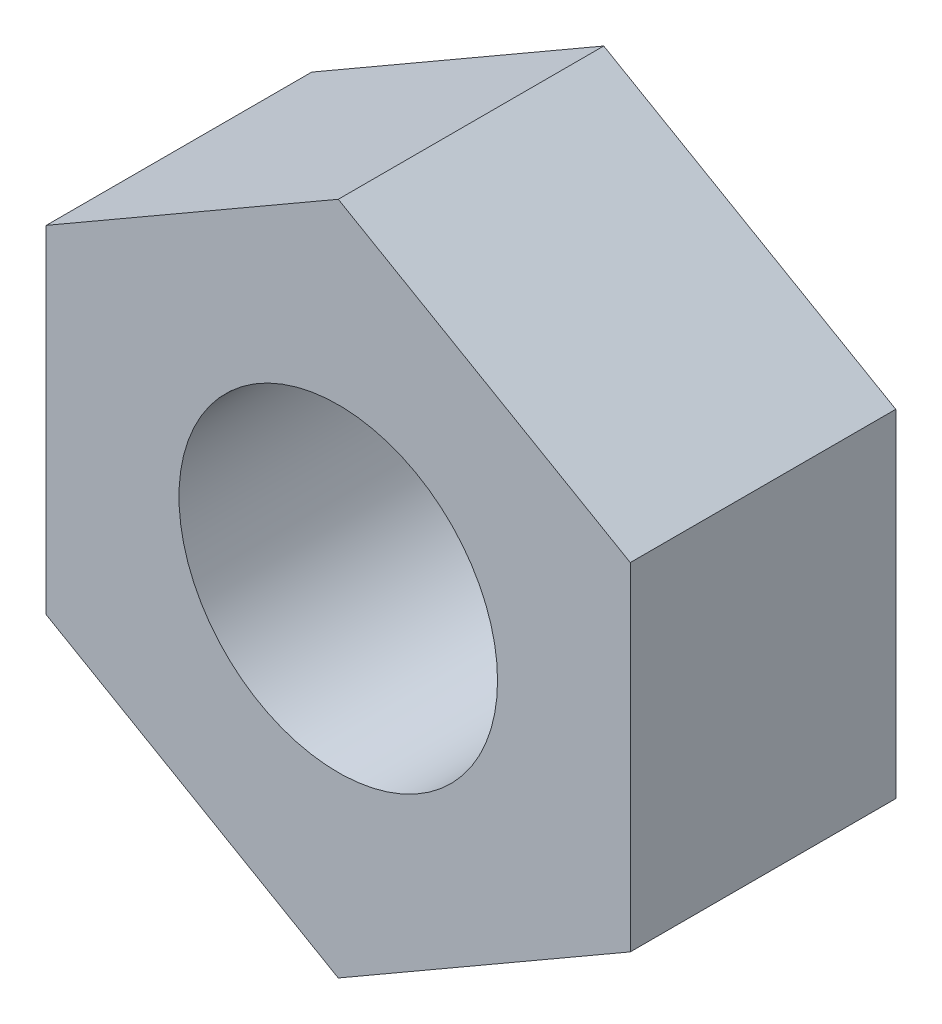
ISO-10303-21;
HEADER;
FILE_DESCRIPTION(('STEP AP214'),'2;1');
FILE_NAME('part.step','',(''),(''),'','','');
FILE_SCHEMA(('AUTOMOTIVE_DESIGN { 1 0 10303 214 1 1 1 1 }'));
ENDSEC;
DATA;
#1=APPLICATION_CONTEXT('core data for automotive mechanical design processes');
#2=APPLICATION_PROTOCOL_DEFINITION('international standard','automotive_design',2000,#1);
#3=PRODUCT_CONTEXT('',#1,'mechanical');
#4=PRODUCT('Part','Part','',(#3));
#5=PRODUCT_RELATED_PRODUCT_CATEGORY('part','',(#4));
#6=PRODUCT_DEFINITION_FORMATION('','',#4);
#7=PRODUCT_DEFINITION_CONTEXT('part definition',#1,'design');
#8=PRODUCT_DEFINITION('design','',#6,#7);
#9=PRODUCT_DEFINITION_SHAPE('','',#8);
#10=(LENGTH_UNIT() NAMED_UNIT(*) SI_UNIT(.MILLI.,.METRE.));
#11=(NAMED_UNIT(*) PLANE_ANGLE_UNIT() SI_UNIT($,.RADIAN.));
#12=(NAMED_UNIT(*) SI_UNIT($,.STERADIAN.) SOLID_ANGLE_UNIT());
#13=UNCERTAINTY_MEASURE_WITH_UNIT(LENGTH_MEASURE(1.E-05),#10,'distance_accuracy_value','');
#14=(GEOMETRIC_REPRESENTATION_CONTEXT(3) GLOBAL_UNCERTAINTY_ASSIGNED_CONTEXT((#13)) GLOBAL_UNIT_ASSIGNED_CONTEXT((#10,
#11,#12)) REPRESENTATION_CONTEXT('',''));
#15=CARTESIAN_POINT('',(0.,0.,0.));
#16=DIRECTION('',(0.,0.,1.));
#17=DIRECTION('',(1.,0.,0.));
#18=AXIS2_PLACEMENT_3D('',#15,#16,#17);
#19=CARTESIAN_POINT('',(0.,0.,2.5));
#20=DIRECTION('',(0.,0.,1.));
#21=DIRECTION('',(1.,0.,0.));
#22=AXIS2_PLACEMENT_3D('',#19,#20,#21);
#23=PLANE('',#22);
#24=DIRECTION('',(0.866025403784439,0.5,0.));
#25=VECTOR('',#24,1.);
#26=CARTESIAN_POINT('',(0.,-3.17542648054294,2.5));
#27=LINE('',#26,#25);
#28=CARTESIAN_POINT('',(0.,-3.17542648054294,2.5));
#29=VERTEX_POINT('',#28);
#30=CARTESIAN_POINT('',(2.75,-1.58771324027147,2.5));
#31=VERTEX_POINT('',#30);
#32=EDGE_CURVE('E129',#29,#31,#27,.T.);
#33=ORIENTED_EDGE('',*,*,#32,.T.);
#34=DIRECTION('',(0.,1.,0.));
#35=VECTOR('',#34,1.);
#36=CARTESIAN_POINT('',(2.75,-1.58771324027147,2.5));
#37=LINE('',#36,#35);
#38=CARTESIAN_POINT('',(2.75,1.58771324027147,2.5));
#39=VERTEX_POINT('',#38);
#40=EDGE_CURVE('E87',#31,#39,#37,.T.);
#41=ORIENTED_EDGE('',*,*,#40,.T.);
#42=DIRECTION('',(-0.866025403784439,0.5,0.));
#43=VECTOR('',#42,1.);
#44=CARTESIAN_POINT('',(2.75,1.58771324027147,2.5));
#45=LINE('',#44,#43);
#46=CARTESIAN_POINT('',(0.,3.17542648054294,2.5));
#47=VERTEX_POINT('',#46);
#48=EDGE_CURVE('E100',#39,#47,#45,.T.);
#49=ORIENTED_EDGE('',*,*,#48,.T.);
#50=DIRECTION('',(-0.866025403784439,-0.5,0.));
#51=VECTOR('',#50,1.);
#52=CARTESIAN_POINT('',(0.,3.17542648054294,2.5));
#53=LINE('',#52,#51);
#54=CARTESIAN_POINT('',(-2.75,1.58771324027147,2.5));
#55=VERTEX_POINT('',#54);
#56=EDGE_CURVE('E94',#47,#55,#53,.T.);
#57=ORIENTED_EDGE('',*,*,#56,.T.);
#58=DIRECTION('',(0.,-1.,0.));
#59=VECTOR('',#58,1.);
#60=CARTESIAN_POINT('',(-2.75,1.58771324027147,2.5));
#61=LINE('',#60,#59);
#62=CARTESIAN_POINT('',(-2.75,-1.58771324027147,2.5));
#63=VERTEX_POINT('',#62);
#64=EDGE_CURVE('E98',#55,#63,#61,.T.);
#65=ORIENTED_EDGE('',*,*,#64,.T.);
#66=DIRECTION('',(0.866025403784438,-0.5,0.));
#67=VECTOR('',#66,1.);
#68=CARTESIAN_POINT('',(-2.75,-1.58771324027147,2.5));
#69=LINE('',#68,#67);
#70=EDGE_CURVE('E50',#63,#29,#69,.T.);
#71=ORIENTED_EDGE('',*,*,#70,.T.);
#72=EDGE_LOOP('',(#33,#41,#49,#57,#65,#71));
#73=FACE_BOUND('',#72,.T.);
#74=CARTESIAN_POINT('',(0.,0.,2.5));
#75=DIRECTION('',(0.,0.,1.));
#76=DIRECTION('',(1.,0.,0.));
#77=AXIS2_PLACEMENT_3D('',#74,#75,#76);
#78=CIRCLE('',#77,1.5);
#79=CARTESIAN_POINT('',(1.5,0.,2.5));
#80=VERTEX_POINT('',#79);
#81=EDGE_CURVE('E122',#80,#80,#78,.T.);
#82=ORIENTED_EDGE('',*,*,#81,.F.);
#83=EDGE_LOOP('',(#82));
#84=FACE_BOUND('',#83,.T.);
#85=ADVANCED_FACE('F33',(#73,#84),#23,.T.);
#86=CARTESIAN_POINT('',(0.,0.,0.));
#87=DIRECTION('',(0.,0.,1.));
#88=DIRECTION('',(1.,0.,0.));
#89=AXIS2_PLACEMENT_3D('',#86,#87,#88);
#90=PLANE('',#89);
#91=DIRECTION('',(0.866025403784439,0.5,0.));
#92=VECTOR('',#91,1.);
#93=CARTESIAN_POINT('',(0.,-3.17542648054294,0.));
#94=LINE('',#93,#92);
#95=CARTESIAN_POINT('',(0.,-3.17542648054294,0.));
#96=VERTEX_POINT('',#95);
#97=CARTESIAN_POINT('',(2.75,-1.58771324027147,0.));
#98=VERTEX_POINT('',#97);
#99=EDGE_CURVE('E118',#96,#98,#94,.T.);
#100=ORIENTED_EDGE('',*,*,#99,.F.);
#101=DIRECTION('',(0.866025403784438,-0.5,0.));
#102=VECTOR('',#101,1.);
#103=CARTESIAN_POINT('',(-2.75,-1.58771324027147,0.));
#104=LINE('',#103,#102);
#105=CARTESIAN_POINT('',(-2.75,-1.58771324027147,0.));
#106=VERTEX_POINT('',#105);
#107=EDGE_CURVE('E79',#106,#96,#104,.T.);
#108=ORIENTED_EDGE('',*,*,#107,.F.);
#109=DIRECTION('',(0.,-1.,0.));
#110=VECTOR('',#109,1.);
#111=CARTESIAN_POINT('',(-2.75,1.58771324027147,0.));
#112=LINE('',#111,#110);
#113=CARTESIAN_POINT('',(-2.75,1.58771324027147,0.));
#114=VERTEX_POINT('',#113);
#115=EDGE_CURVE('E73',#114,#106,#112,.T.);
#116=ORIENTED_EDGE('',*,*,#115,.F.);
#117=DIRECTION('',(-0.866025403784439,-0.5,0.));
#118=VECTOR('',#117,1.);
#119=CARTESIAN_POINT('',(0.,3.17542648054294,0.));
#120=LINE('',#119,#118);
#121=CARTESIAN_POINT('',(0.,3.17542648054294,0.));
#122=VERTEX_POINT('',#121);
#123=EDGE_CURVE('E108',#122,#114,#120,.T.);
#124=ORIENTED_EDGE('',*,*,#123,.F.);
#125=DIRECTION('',(-0.866025403784439,0.5,0.));
#126=VECTOR('',#125,1.);
#127=CARTESIAN_POINT('',(2.75,1.58771324027147,0.));
#128=LINE('',#127,#126);
#129=CARTESIAN_POINT('',(2.75,1.58771324027147,0.));
#130=VERTEX_POINT('',#129);
#131=EDGE_CURVE('E124',#130,#122,#128,.T.);
#132=ORIENTED_EDGE('',*,*,#131,.F.);
#133=DIRECTION('',(0.,1.,0.));
#134=VECTOR('',#133,1.);
#135=CARTESIAN_POINT('',(2.75,-1.58771324027147,0.));
#136=LINE('',#135,#134);
#137=EDGE_CURVE('E121',#98,#130,#136,.T.);
#138=ORIENTED_EDGE('',*,*,#137,.F.);
#139=EDGE_LOOP('',(#100,#108,#116,#124,#132,#138));
#140=FACE_BOUND('',#139,.T.);
#141=CARTESIAN_POINT('',(0.,0.,0.));
#142=DIRECTION('',(0.,0.,1.));
#143=DIRECTION('',(1.,0.,0.));
#144=AXIS2_PLACEMENT_3D('',#141,#142,#143);
#145=CIRCLE('',#144,1.5);
#146=CARTESIAN_POINT('',(1.5,0.,0.));
#147=VERTEX_POINT('',#146);
#148=EDGE_CURVE('E222',#147,#147,#145,.T.);
#149=ORIENTED_EDGE('',*,*,#148,.T.);
#150=EDGE_LOOP('',(#149));
#151=FACE_BOUND('',#150,.T.);
#152=ADVANCED_FACE('F138',(#140,#151),#90,.F.);
#153=CARTESIAN_POINT('',(0.,-3.17542648054294,2.5));
#154=DIRECTION('',(-0.5,0.866025403784439,0.));
#155=DIRECTION('',(-0.866025403784439,-0.5,0.));
#156=AXIS2_PLACEMENT_3D('',#153,#154,#155);
#157=PLANE('',#156);
#158=ORIENTED_EDGE('',*,*,#99,.T.);
#159=DIRECTION('',(0.,0.,-1.));
#160=VECTOR('',#159,1.);
#161=CARTESIAN_POINT('',(2.75,-1.58771324027147,2.5));
#162=LINE('',#161,#160);
#163=EDGE_CURVE('E11',#31,#98,#162,.T.);
#164=ORIENTED_EDGE('',*,*,#163,.F.);
#165=ORIENTED_EDGE('',*,*,#32,.F.);
#166=DIRECTION('',(0.,0.,-1.));
#167=VECTOR('',#166,1.);
#168=CARTESIAN_POINT('',(0.,-3.17542648054294,2.5));
#169=LINE('',#168,#167);
#170=EDGE_CURVE('E114',#29,#96,#169,.T.);
#171=ORIENTED_EDGE('',*,*,#170,.T.);
#172=EDGE_LOOP('',(#158,#164,#165,#171));
#173=FACE_BOUND('',#172,.T.);
#174=ADVANCED_FACE('F35',(#173),#157,.F.);
#175=CARTESIAN_POINT('',(2.75,-1.58771324027147,2.5));
#176=DIRECTION('',(-1.,0.,0.));
#177=DIRECTION('',(0.,0.,1.));
#178=AXIS2_PLACEMENT_3D('',#175,#176,#177);
#179=PLANE('',#178);
#180=ORIENTED_EDGE('',*,*,#137,.T.);
#181=DIRECTION('',(0.,0.,-1.));
#182=VECTOR('',#181,1.);
#183=CARTESIAN_POINT('',(2.75,1.58771324027147,2.5));
#184=LINE('',#183,#182);
#185=EDGE_CURVE('E42',#39,#130,#184,.T.);
#186=ORIENTED_EDGE('',*,*,#185,.F.);
#187=ORIENTED_EDGE('',*,*,#40,.F.);
#188=ORIENTED_EDGE('',*,*,#163,.T.);
#189=EDGE_LOOP('',(#180,#186,#187,#188));
#190=FACE_BOUND('',#189,.T.);
#191=ADVANCED_FACE('F163',(#190),#179,.F.);
#192=CARTESIAN_POINT('',(2.75,1.58771324027147,2.5));
#193=DIRECTION('',(-0.5,-0.866025403784439,0.));
#194=DIRECTION('',(0.866025403784439,-0.5,0.));
#195=AXIS2_PLACEMENT_3D('',#192,#193,#194);
#196=PLANE('',#195);
#197=ORIENTED_EDGE('',*,*,#131,.T.);
#198=DIRECTION('',(0.,0.,-1.));
#199=VECTOR('',#198,1.);
#200=CARTESIAN_POINT('',(0.,3.17542648054294,2.5));
#201=LINE('',#200,#199);
#202=EDGE_CURVE('E109',#47,#122,#201,.T.);
#203=ORIENTED_EDGE('',*,*,#202,.F.);
#204=ORIENTED_EDGE('',*,*,#48,.F.);
#205=ORIENTED_EDGE('',*,*,#185,.T.);
#206=EDGE_LOOP('',(#197,#203,#204,#205));
#207=FACE_BOUND('',#206,.T.);
#208=ADVANCED_FACE('F135',(#207),#196,.F.);
#209=CARTESIAN_POINT('',(0.,3.17542648054294,2.5));
#210=DIRECTION('',(0.5,-0.866025403784439,0.));
#211=DIRECTION('',(0.866025403784439,0.5,0.));
#212=AXIS2_PLACEMENT_3D('',#209,#210,#211);
#213=PLANE('',#212);
#214=ORIENTED_EDGE('',*,*,#123,.T.);
#215=DIRECTION('',(0.,0.,-1.));
#216=VECTOR('',#215,1.);
#217=CARTESIAN_POINT('',(-2.75,1.58771324027147,2.5));
#218=LINE('',#217,#216);
#219=EDGE_CURVE('E105',#55,#114,#218,.T.);
#220=ORIENTED_EDGE('',*,*,#219,.F.);
#221=ORIENTED_EDGE('',*,*,#56,.F.);
#222=ORIENTED_EDGE('',*,*,#202,.T.);
#223=EDGE_LOOP('',(#214,#220,#221,#222));
#224=FACE_BOUND('',#223,.T.);
#225=ADVANCED_FACE('F106',(#224),#213,.F.);
#226=CARTESIAN_POINT('',(-2.75,1.58771324027147,2.5));
#227=DIRECTION('',(1.,0.,0.));
#228=DIRECTION('',(0.,0.,-1.));
#229=AXIS2_PLACEMENT_3D('',#226,#227,#228);
#230=PLANE('',#229);
#231=ORIENTED_EDGE('',*,*,#115,.T.);
#232=DIRECTION('',(0.,0.,-1.));
#233=VECTOR('',#232,1.);
#234=CARTESIAN_POINT('',(-2.75,-1.58771324027147,2.5));
#235=LINE('',#234,#233);
#236=EDGE_CURVE('E110',#63,#106,#235,.T.);
#237=ORIENTED_EDGE('',*,*,#236,.F.);
#238=ORIENTED_EDGE('',*,*,#64,.F.);
#239=ORIENTED_EDGE('',*,*,#219,.T.);
#240=EDGE_LOOP('',(#231,#237,#238,#239));
#241=FACE_BOUND('',#240,.T.);
#242=ADVANCED_FACE('F112',(#241),#230,.F.);
#243=CARTESIAN_POINT('',(-2.75,-1.58771324027147,2.5));
#244=DIRECTION('',(0.5,0.866025403784439,0.));
#245=DIRECTION('',(-0.866025403784439,0.5,0.));
#246=AXIS2_PLACEMENT_3D('',#243,#244,#245);
#247=PLANE('',#246);
#248=ORIENTED_EDGE('',*,*,#107,.T.);
#249=ORIENTED_EDGE('',*,*,#170,.F.);
#250=ORIENTED_EDGE('',*,*,#70,.F.);
#251=ORIENTED_EDGE('',*,*,#236,.T.);
#252=EDGE_LOOP('',(#248,#249,#250,#251));
#253=FACE_BOUND('',#252,.T.);
#254=ADVANCED_FACE('F143',(#253),#247,.F.);
#255=CARTESIAN_POINT('',(0.,0.,2.5));
#256=DIRECTION('',(0.,0.,-1.));
#257=DIRECTION('',(-1.,0.,0.));
#258=AXIS2_PLACEMENT_3D('',#255,#256,#257);
#259=CYLINDRICAL_SURFACE('',#258,1.5);
#260=ORIENTED_EDGE('',*,*,#81,.T.);
#261=EDGE_LOOP('',(#260));
#262=FACE_BOUND('',#261,.T.);
#263=ORIENTED_EDGE('',*,*,#148,.F.);
#264=EDGE_LOOP('',(#263));
#265=FACE_BOUND('',#264,.T.);
#266=ADVANCED_FACE('F145',(#262,#265),#259,.F.);
#267=CLOSED_SHELL('',(#85,#152,#174,#191,#208,#225,#242,#254,#266));
#268=MANIFOLD_SOLID_BREP('B2',#267);
#269=ADVANCED_BREP_SHAPE_REPRESENTATION('',(#18,#268),#14);
#270=SHAPE_DEFINITION_REPRESENTATION(#9,#269);
ENDSEC;
END-ISO-10303-21;
